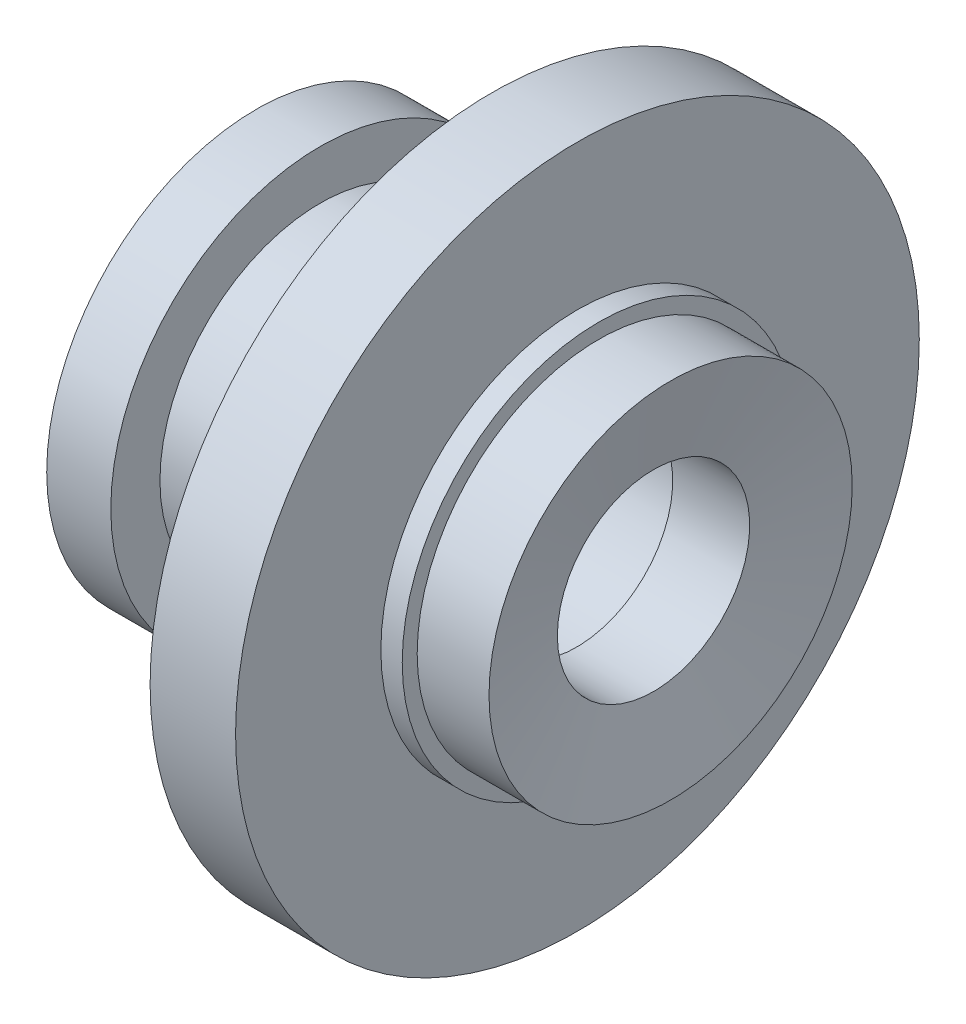
ISO-10303-21;
HEADER;
FILE_DESCRIPTION(('STEP AP214'),'2;1');
FILE_NAME('part.step','',(''),(''),'','','');
FILE_SCHEMA(('AUTOMOTIVE_DESIGN { 1 0 10303 214 1 1 1 1 }'));
ENDSEC;
DATA;
#1=APPLICATION_CONTEXT('core data for automotive mechanical design processes');
#2=APPLICATION_PROTOCOL_DEFINITION('international standard','automotive_design',2000,#1);
#3=PRODUCT_CONTEXT('',#1,'mechanical');
#4=PRODUCT('Part','Part','',(#3));
#5=PRODUCT_RELATED_PRODUCT_CATEGORY('part','',(#4));
#6=PRODUCT_DEFINITION_FORMATION('','',#4);
#7=PRODUCT_DEFINITION_CONTEXT('part definition',#1,'design');
#8=PRODUCT_DEFINITION('design','',#6,#7);
#9=PRODUCT_DEFINITION_SHAPE('','',#8);
#10=(LENGTH_UNIT() NAMED_UNIT(*) SI_UNIT(.MILLI.,.METRE.));
#11=(NAMED_UNIT(*) PLANE_ANGLE_UNIT() SI_UNIT($,.RADIAN.));
#12=(NAMED_UNIT(*) SI_UNIT($,.STERADIAN.) SOLID_ANGLE_UNIT());
#13=UNCERTAINTY_MEASURE_WITH_UNIT(LENGTH_MEASURE(1.E-05),#10,'distance_accuracy_value','');
#14=(GEOMETRIC_REPRESENTATION_CONTEXT(3) GLOBAL_UNCERTAINTY_ASSIGNED_CONTEXT((#13)) GLOBAL_UNIT_ASSIGNED_CONTEXT((#10,
#11,#12)) REPRESENTATION_CONTEXT('',''));
#15=CARTESIAN_POINT('',(0.,0.,0.));
#16=DIRECTION('',(0.,0.,1.));
#17=DIRECTION('',(1.,0.,0.));
#18=AXIS2_PLACEMENT_3D('',#15,#16,#17);
#19=CARTESIAN_POINT('',(0.,21.5,0.));
#20=DIRECTION('',(1.,0.,0.));
#21=DIRECTION('',(0.,0.,-1.));
#22=AXIS2_PLACEMENT_3D('',#19,#20,#21);
#23=PLANE('',#22);
#24=CARTESIAN_POINT('',(0.,-27.5,0.));
#25=DIRECTION('',(-1.,0.,0.));
#26=DIRECTION('',(0.,0.,1.));
#27=AXIS2_PLACEMENT_3D('',#24,#25,#26);
#28=CIRCLE('',#27,27.5);
#29=CARTESIAN_POINT('',(0.,-27.5,27.5));
#30=VERTEX_POINT('',#29);
#31=EDGE_CURVE('E10',#30,#30,#28,.T.);
#32=ORIENTED_EDGE('',*,*,#31,.F.);
#33=EDGE_LOOP('',(#32));
#34=FACE_BOUND('',#33,.T.);
#35=CARTESIAN_POINT('',(0.,-27.5,0.));
#36=DIRECTION('',(-1.,0.,0.));
#37=DIRECTION('',(0.,0.,1.));
#38=AXIS2_PLACEMENT_3D('',#35,#36,#37);
#39=CIRCLE('',#38,49.);
#40=CARTESIAN_POINT('',(0.,-27.5,49.));
#41=VERTEX_POINT('',#40);
#42=EDGE_CURVE('E83',#41,#41,#39,.T.);
#43=ORIENTED_EDGE('',*,*,#42,.T.);
#44=EDGE_LOOP('',(#43));
#45=FACE_BOUND('',#44,.T.);
#46=ADVANCED_FACE('F37',(#34,#45),#23,.F.);
#47=CARTESIAN_POINT('',(0.,-27.5,0.));
#48=DIRECTION('',(-1.,0.,0.));
#49=DIRECTION('',(0.,0.,1.));
#50=AXIS2_PLACEMENT_3D('',#47,#48,#49);
#51=CYLINDRICAL_SURFACE('',#50,27.5);
#52=CARTESIAN_POINT('',(75.,-27.5,0.));
#53=DIRECTION('',(-1.,0.,0.));
#54=DIRECTION('',(0.,0.,1.));
#55=AXIS2_PLACEMENT_3D('',#52,#53,#54);
#56=CIRCLE('',#55,27.5);
#57=CARTESIAN_POINT('',(75.,-27.5,27.5));
#58=VERTEX_POINT('',#57);
#59=EDGE_CURVE('E43',#58,#58,#56,.T.);
#60=ORIENTED_EDGE('',*,*,#59,.F.);
#61=EDGE_LOOP('',(#60));
#62=FACE_BOUND('',#61,.T.);
#63=ORIENTED_EDGE('',*,*,#31,.T.);
#64=EDGE_LOOP('',(#63));
#65=FACE_BOUND('',#64,.T.);
#66=ADVANCED_FACE('F156',(#62,#65),#51,.F.);
#67=CARTESIAN_POINT('',(75.,0.,0.));
#68=DIRECTION('',(1.,0.,0.));
#69=DIRECTION('',(0.,0.,-1.));
#70=AXIS2_PLACEMENT_3D('',#67,#68,#69);
#71=PLANE('',#70);
#72=CARTESIAN_POINT('',(75.,-27.5,0.));
#73=DIRECTION('',(-1.,0.,0.));
#74=DIRECTION('',(0.,0.,1.));
#75=AXIS2_PLACEMENT_3D('',#72,#73,#74);
#76=CIRCLE('',#75,22.5);
#77=CARTESIAN_POINT('',(75.,-27.5,22.5));
#78=VERTEX_POINT('',#77);
#79=EDGE_CURVE('E47',#78,#78,#76,.T.);
#80=ORIENTED_EDGE('',*,*,#79,.F.);
#81=EDGE_LOOP('',(#80));
#82=FACE_BOUND('',#81,.T.);
#83=ORIENTED_EDGE('',*,*,#59,.T.);
#84=EDGE_LOOP('',(#83));
#85=FACE_BOUND('',#84,.T.);
#86=ADVANCED_FACE('F151',(#82,#85),#71,.F.);
#87=CARTESIAN_POINT('',(0.,-27.5,0.));
#88=DIRECTION('',(-1.,0.,0.));
#89=DIRECTION('',(0.,0.,1.));
#90=AXIS2_PLACEMENT_3D('',#87,#88,#89);
#91=CYLINDRICAL_SURFACE('',#90,22.5);
#92=CARTESIAN_POINT('',(93.,-27.5,0.));
#93=DIRECTION('',(-1.,0.,0.));
#94=DIRECTION('',(0.,0.,1.));
#95=AXIS2_PLACEMENT_3D('',#92,#93,#94);
#96=CIRCLE('',#95,22.5);
#97=CARTESIAN_POINT('',(93.,-27.5,22.5));
#98=VERTEX_POINT('',#97);
#99=EDGE_CURVE('E51',#98,#98,#96,.T.);
#100=ORIENTED_EDGE('',*,*,#99,.F.);
#101=EDGE_LOOP('',(#100));
#102=FACE_BOUND('',#101,.T.);
#103=ORIENTED_EDGE('',*,*,#79,.T.);
#104=EDGE_LOOP('',(#103));
#105=FACE_BOUND('',#104,.T.);
#106=ADVANCED_FACE('F145',(#102,#105),#91,.F.);
#107=CARTESIAN_POINT('',(93.,-27.5,0.));
#108=DIRECTION('',(1.,0.,0.));
#109=DIRECTION('',(0.,0.,-1.));
#110=AXIS2_PLACEMENT_3D('',#107,#108,#109);
#111=CONICAL_SURFACE('',#110,22.5,1.37340076694502);
#112=CARTESIAN_POINT('',(97.,-27.5,0.));
#113=DIRECTION('',(-1.,0.,0.));
#114=DIRECTION('',(0.,0.,1.));
#115=AXIS2_PLACEMENT_3D('',#112,#113,#114);
#116=CIRCLE('',#115,42.5);
#117=CARTESIAN_POINT('',(97.,-27.5,42.5));
#118=VERTEX_POINT('',#117);
#119=EDGE_CURVE('E56',#118,#118,#116,.T.);
#120=ORIENTED_EDGE('',*,*,#119,.F.);
#121=EDGE_LOOP('',(#120));
#122=FACE_BOUND('',#121,.T.);
#123=ORIENTED_EDGE('',*,*,#99,.T.);
#124=EDGE_LOOP('',(#123));
#125=FACE_BOUND('',#124,.T.);
#126=ADVANCED_FACE('F139',(#122,#125),#111,.F.);
#127=CARTESIAN_POINT('',(0.,-27.5,0.));
#128=DIRECTION('',(-1.,0.,0.));
#129=DIRECTION('',(0.,0.,1.));
#130=AXIS2_PLACEMENT_3D('',#127,#128,#129);
#131=CYLINDRICAL_SURFACE('',#130,42.5);
#132=CARTESIAN_POINT('',(80.194872218323,-27.5,0.));
#133=DIRECTION('',(-1.,0.,0.));
#134=DIRECTION('',(0.,0.,1.));
#135=AXIS2_PLACEMENT_3D('',#132,#133,#134);
#136=CIRCLE('',#135,42.5);
#137=CARTESIAN_POINT('',(80.194872218323,-27.5,42.5));
#138=VERTEX_POINT('',#137);
#139=EDGE_CURVE('E59',#138,#138,#136,.T.);
#140=ORIENTED_EDGE('',*,*,#139,.F.);
#141=EDGE_LOOP('',(#140));
#142=FACE_BOUND('',#141,.T.);
#143=ORIENTED_EDGE('',*,*,#119,.T.);
#144=EDGE_LOOP('',(#143));
#145=FACE_BOUND('',#144,.T.);
#146=ADVANCED_FACE('F133',(#142,#145),#131,.T.);
#147=CARTESIAN_POINT('',(80.194872218323,15.,0.));
#148=DIRECTION('',(-1.,0.,0.));
#149=DIRECTION('',(0.,0.,1.));
#150=AXIS2_PLACEMENT_3D('',#147,#148,#149);
#151=PLANE('',#150);
#152=CARTESIAN_POINT('',(80.194872218323,-27.5,0.));
#153=DIRECTION('',(-1.,0.,0.));
#154=DIRECTION('',(0.,0.,1.));
#155=AXIS2_PLACEMENT_3D('',#152,#153,#154);
#156=CIRCLE('',#155,46.);
#157=CARTESIAN_POINT('',(80.194872218323,-27.5,46.));
#158=VERTEX_POINT('',#157);
#159=EDGE_CURVE('E62',#158,#158,#156,.T.);
#160=ORIENTED_EDGE('',*,*,#159,.F.);
#161=EDGE_LOOP('',(#160));
#162=FACE_BOUND('',#161,.T.);
#163=ORIENTED_EDGE('',*,*,#139,.T.);
#164=EDGE_LOOP('',(#163));
#165=FACE_BOUND('',#164,.T.);
#166=ADVANCED_FACE('F127',(#162,#165),#151,.F.);
#167=CARTESIAN_POINT('',(0.,-27.5,0.));
#168=DIRECTION('',(-1.,0.,0.));
#169=DIRECTION('',(0.,0.,1.));
#170=AXIS2_PLACEMENT_3D('',#167,#168,#169);
#171=CYLINDRICAL_SURFACE('',#170,46.);
#172=CARTESIAN_POINT('',(75.194872218323,-27.5,0.));
#173=DIRECTION('',(-1.,0.,0.));
#174=DIRECTION('',(0.,0.,1.));
#175=AXIS2_PLACEMENT_3D('',#172,#173,#174);
#176=CIRCLE('',#175,46.);
#177=CARTESIAN_POINT('',(75.194872218323,-27.5,46.));
#178=VERTEX_POINT('',#177);
#179=EDGE_CURVE('E65',#178,#178,#176,.T.);
#180=ORIENTED_EDGE('',*,*,#179,.F.);
#181=EDGE_LOOP('',(#180));
#182=FACE_BOUND('',#181,.T.);
#183=ORIENTED_EDGE('',*,*,#159,.T.);
#184=EDGE_LOOP('',(#183));
#185=FACE_BOUND('',#184,.T.);
#186=ADVANCED_FACE('F121',(#182,#185),#171,.T.);
#187=CARTESIAN_POINT('',(75.194872218323,18.5,0.));
#188=DIRECTION('',(-1.,0.,0.));
#189=DIRECTION('',(0.,0.,1.));
#190=AXIS2_PLACEMENT_3D('',#187,#188,#189);
#191=PLANE('',#190);
#192=CARTESIAN_POINT('',(75.194872218323,-27.5,0.));
#193=DIRECTION('',(-1.,0.,0.));
#194=DIRECTION('',(0.,0.,1.));
#195=AXIS2_PLACEMENT_3D('',#192,#193,#194);
#196=CIRCLE('',#195,80.);
#197=CARTESIAN_POINT('',(75.194872218323,-27.5,80.));
#198=VERTEX_POINT('',#197);
#199=EDGE_CURVE('E68',#198,#198,#196,.T.);
#200=ORIENTED_EDGE('',*,*,#199,.F.);
#201=EDGE_LOOP('',(#200));
#202=FACE_BOUND('',#201,.T.);
#203=ORIENTED_EDGE('',*,*,#179,.T.);
#204=EDGE_LOOP('',(#203));
#205=FACE_BOUND('',#204,.T.);
#206=ADVANCED_FACE('F115',(#202,#205),#191,.F.);
#207=CARTESIAN_POINT('',(0.,-27.5,0.));
#208=DIRECTION('',(-1.,0.,0.));
#209=DIRECTION('',(0.,0.,1.));
#210=AXIS2_PLACEMENT_3D('',#207,#208,#209);
#211=CYLINDRICAL_SURFACE('',#210,80.);
#212=CARTESIAN_POINT('',(55.194872218323,-27.5,0.));
#213=DIRECTION('',(-1.,0.,0.));
#214=DIRECTION('',(0.,0.,1.));
#215=AXIS2_PLACEMENT_3D('',#212,#213,#214);
#216=CIRCLE('',#215,80.);
#217=CARTESIAN_POINT('',(55.194872218323,-27.5,80.));
#218=VERTEX_POINT('',#217);
#219=EDGE_CURVE('E71',#218,#218,#216,.T.);
#220=ORIENTED_EDGE('',*,*,#219,.F.);
#221=EDGE_LOOP('',(#220));
#222=FACE_BOUND('',#221,.T.);
#223=ORIENTED_EDGE('',*,*,#199,.T.);
#224=EDGE_LOOP('',(#223));
#225=FACE_BOUND('',#224,.T.);
#226=ADVANCED_FACE('F109',(#222,#225),#211,.T.);
#227=CARTESIAN_POINT('',(55.194872218323,52.5,0.));
#228=DIRECTION('',(1.,0.,0.));
#229=DIRECTION('',(0.,0.,-1.));
#230=AXIS2_PLACEMENT_3D('',#227,#228,#229);
#231=PLANE('',#230);
#232=CARTESIAN_POINT('',(55.194872218323,-27.5,0.));
#233=DIRECTION('',(-1.,0.,0.));
#234=DIRECTION('',(0.,0.,1.));
#235=AXIS2_PLACEMENT_3D('',#232,#233,#234);
#236=CIRCLE('',#235,37.5);
#237=CARTESIAN_POINT('',(55.194872218323,-27.5,37.5));
#238=VERTEX_POINT('',#237);
#239=EDGE_CURVE('E74',#238,#238,#236,.T.);
#240=ORIENTED_EDGE('',*,*,#239,.F.);
#241=EDGE_LOOP('',(#240));
#242=FACE_BOUND('',#241,.T.);
#243=ORIENTED_EDGE('',*,*,#219,.T.);
#244=EDGE_LOOP('',(#243));
#245=FACE_BOUND('',#244,.T.);
#246=ADVANCED_FACE('F103',(#242,#245),#231,.F.);
#247=CARTESIAN_POINT('',(0.,-27.5,0.));
#248=DIRECTION('',(-1.,0.,0.));
#249=DIRECTION('',(0.,0.,1.));
#250=AXIS2_PLACEMENT_3D('',#247,#248,#249);
#251=CYLINDRICAL_SURFACE('',#250,37.5);
#252=CARTESIAN_POINT('',(15.,-27.5,0.));
#253=DIRECTION('',(-1.,0.,0.));
#254=DIRECTION('',(0.,0.,1.));
#255=AXIS2_PLACEMENT_3D('',#252,#253,#254);
#256=CIRCLE('',#255,37.5);
#257=CARTESIAN_POINT('',(15.,-27.5,37.5));
#258=VERTEX_POINT('',#257);
#259=EDGE_CURVE('E77',#258,#258,#256,.T.);
#260=ORIENTED_EDGE('',*,*,#259,.F.);
#261=EDGE_LOOP('',(#260));
#262=FACE_BOUND('',#261,.T.);
#263=ORIENTED_EDGE('',*,*,#239,.T.);
#264=EDGE_LOOP('',(#263));
#265=FACE_BOUND('',#264,.T.);
#266=ADVANCED_FACE('F97',(#262,#265),#251,.T.);
#267=CARTESIAN_POINT('',(15.,9.99999999999998,0.));
#268=DIRECTION('',(-1.,0.,0.));
#269=DIRECTION('',(0.,0.,1.));
#270=AXIS2_PLACEMENT_3D('',#267,#268,#269);
#271=PLANE('',#270);
#272=CARTESIAN_POINT('',(15.,-27.5,0.));
#273=DIRECTION('',(-1.,0.,0.));
#274=DIRECTION('',(0.,0.,1.));
#275=AXIS2_PLACEMENT_3D('',#272,#273,#274);
#276=CIRCLE('',#275,49.);
#277=CARTESIAN_POINT('',(15.,-27.5,49.));
#278=VERTEX_POINT('',#277);
#279=EDGE_CURVE('E80',#278,#278,#276,.T.);
#280=ORIENTED_EDGE('',*,*,#279,.F.);
#281=EDGE_LOOP('',(#280));
#282=FACE_BOUND('',#281,.T.);
#283=ORIENTED_EDGE('',*,*,#259,.T.);
#284=EDGE_LOOP('',(#283));
#285=FACE_BOUND('',#284,.T.);
#286=ADVANCED_FACE('F91',(#282,#285),#271,.F.);
#287=CARTESIAN_POINT('',(0.,-27.5,0.));
#288=DIRECTION('',(-1.,0.,0.));
#289=DIRECTION('',(0.,0.,1.));
#290=AXIS2_PLACEMENT_3D('',#287,#288,#289);
#291=CYLINDRICAL_SURFACE('',#290,49.);
#292=ORIENTED_EDGE('',*,*,#42,.F.);
#293=EDGE_LOOP('',(#292));
#294=FACE_BOUND('',#293,.T.);
#295=ORIENTED_EDGE('',*,*,#279,.T.);
#296=EDGE_LOOP('',(#295));
#297=FACE_BOUND('',#296,.T.);
#298=ADVANCED_FACE('F88',(#294,#297),#291,.T.);
#299=CLOSED_SHELL('',(#46,#66,#86,#106,#126,#146,#166,#186,#206,#226,#246,#266,#286,#298));
#300=MANIFOLD_SOLID_BREP('B2',#299);
#301=ADVANCED_BREP_SHAPE_REPRESENTATION('',(#18,#300),#14);
#302=SHAPE_DEFINITION_REPRESENTATION(#9,#301);
ENDSEC;
END-ISO-10303-21;
